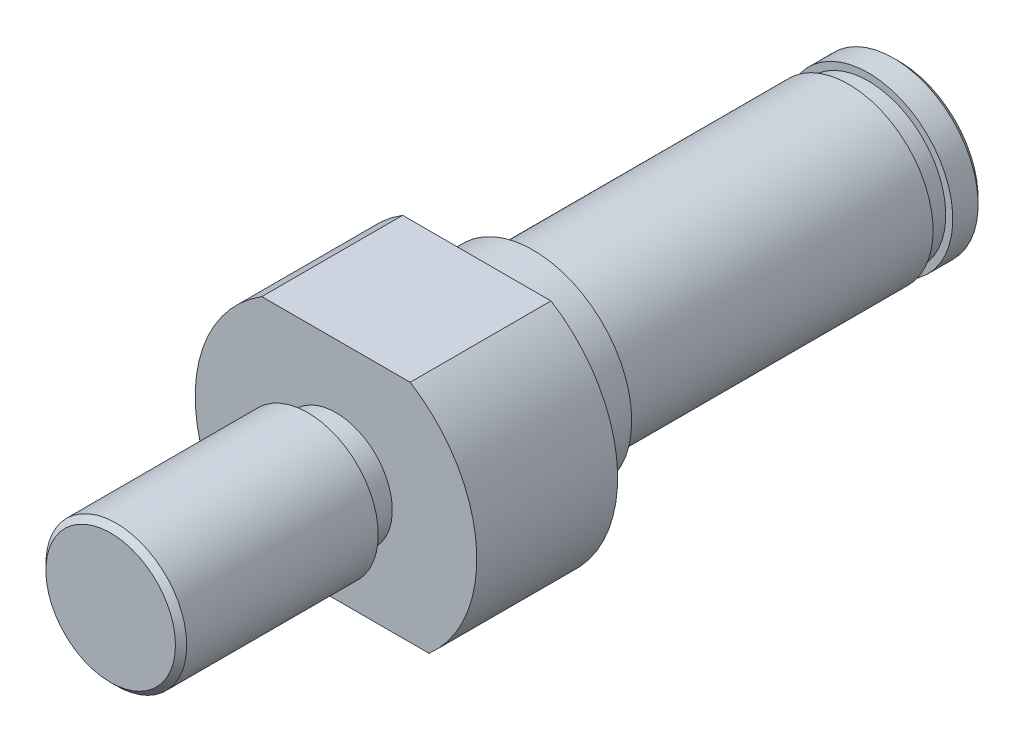
ISO-10303-21;
HEADER;
FILE_DESCRIPTION(('STEP AP214'),'2;1');
FILE_NAME('part.step','',(''),(''),'','','');
FILE_SCHEMA(('AUTOMOTIVE_DESIGN { 1 0 10303 214 1 1 1 1 }'));
ENDSEC;
DATA;
#1=APPLICATION_CONTEXT('core data for automotive mechanical design processes');
#2=APPLICATION_PROTOCOL_DEFINITION('international standard','automotive_design',2000,#1);
#3=PRODUCT_CONTEXT('',#1,'mechanical');
#4=PRODUCT('Part','Part','',(#3));
#5=PRODUCT_RELATED_PRODUCT_CATEGORY('part','',(#4));
#6=PRODUCT_DEFINITION_FORMATION('','',#4);
#7=PRODUCT_DEFINITION_CONTEXT('part definition',#1,'design');
#8=PRODUCT_DEFINITION('design','',#6,#7);
#9=PRODUCT_DEFINITION_SHAPE('','',#8);
#10=(LENGTH_UNIT() NAMED_UNIT(*) SI_UNIT(.MILLI.,.METRE.));
#11=(NAMED_UNIT(*) PLANE_ANGLE_UNIT() SI_UNIT($,.RADIAN.));
#12=(NAMED_UNIT(*) SI_UNIT($,.STERADIAN.) SOLID_ANGLE_UNIT());
#13=UNCERTAINTY_MEASURE_WITH_UNIT(LENGTH_MEASURE(1.E-05),#10,'distance_accuracy_value','');
#14=(GEOMETRIC_REPRESENTATION_CONTEXT(3) GLOBAL_UNCERTAINTY_ASSIGNED_CONTEXT((#13)) GLOBAL_UNIT_ASSIGNED_CONTEXT((#10,
#11,#12)) REPRESENTATION_CONTEXT('',''));
#15=CARTESIAN_POINT('',(0.,0.,0.));
#16=DIRECTION('',(0.,0.,1.));
#17=DIRECTION('',(1.,0.,0.));
#18=AXIS2_PLACEMENT_3D('',#15,#16,#17);
#19=CARTESIAN_POINT('',(0.,0.,-15.));
#20=DIRECTION('',(0.,0.,1.));
#21=DIRECTION('',(1.,0.,0.));
#22=AXIS2_PLACEMENT_3D('',#19,#20,#21);
#23=CYLINDRICAL_SURFACE('',#22,3.);
#24=CARTESIAN_POINT('',(0.,0.,-13.2));
#25=DIRECTION('',(0.,0.,-1.));
#26=DIRECTION('',(-1.,0.,0.));
#27=AXIS2_PLACEMENT_3D('',#24,#25,#26);
#28=CIRCLE('',#27,3.);
#29=CARTESIAN_POINT('',(-3.,0.,-13.2));
#30=VERTEX_POINT('',#29);
#31=EDGE_CURVE('E182',#30,#30,#28,.T.);
#32=ORIENTED_EDGE('',*,*,#31,.F.);
#33=EDGE_LOOP('',(#32));
#34=FACE_BOUND('',#33,.T.);
#35=CARTESIAN_POINT('',(0.,0.,-2.));
#36=DIRECTION('',(0.,0.,-1.));
#37=DIRECTION('',(-1.,0.,0.));
#38=AXIS2_PLACEMENT_3D('',#35,#36,#37);
#39=CIRCLE('',#38,3.);
#40=CARTESIAN_POINT('',(-3.,0.,-2.));
#41=VERTEX_POINT('',#40);
#42=EDGE_CURVE('E106',#41,#41,#39,.T.);
#43=ORIENTED_EDGE('',*,*,#42,.T.);
#44=EDGE_LOOP('',(#43));
#45=FACE_BOUND('',#44,.T.);
#46=ADVANCED_FACE('F34',(#34,#45),#23,.T.);
#47=CARTESIAN_POINT('',(0.,0.,0.));
#48=DIRECTION('',(0.,0.,1.));
#49=DIRECTION('',(1.,0.,0.));
#50=AXIS2_PLACEMENT_3D('',#47,#48,#49);
#51=PLANE('',#50);
#52=CARTESIAN_POINT('',(0.,0.,0.));
#53=DIRECTION('',(0.,0.,1.));
#54=DIRECTION('',(1.,0.,0.));
#55=AXIS2_PLACEMENT_3D('',#52,#53,#54);
#56=CIRCLE('',#55,5.);
#57=CARTESIAN_POINT('',(-2.63391343821319,4.25,0.));
#58=VERTEX_POINT('',#57);
#59=CARTESIAN_POINT('',(-3.30718913883074,-3.75,0.));
#60=VERTEX_POINT('',#59);
#61=EDGE_CURVE('E103',#58,#60,#56,.T.);
#62=ORIENTED_EDGE('',*,*,#61,.F.);
#63=DIRECTION('',(-1.,0.,0.));
#64=VECTOR('',#63,1.);
#65=CARTESIAN_POINT('',(-2.63391343821319,4.25,0.));
#66=LINE('',#65,#64);
#67=CARTESIAN_POINT('',(2.63391343821319,4.25,0.));
#68=VERTEX_POINT('',#67);
#69=EDGE_CURVE('E74',#68,#58,#66,.T.);
#70=ORIENTED_EDGE('',*,*,#69,.F.);
#71=CARTESIAN_POINT('',(0.,0.,0.));
#72=DIRECTION('',(0.,0.,1.));
#73=DIRECTION('',(1.,0.,0.));
#74=AXIS2_PLACEMENT_3D('',#71,#72,#73);
#75=CIRCLE('',#74,5.);
#76=CARTESIAN_POINT('',(3.30718913883074,-3.75,0.));
#77=VERTEX_POINT('',#76);
#78=EDGE_CURVE('E68',#77,#68,#75,.T.);
#79=ORIENTED_EDGE('',*,*,#78,.F.);
#80=DIRECTION('',(1.,0.,0.));
#81=VECTOR('',#80,1.);
#82=CARTESIAN_POINT('',(-3.30718913883074,-3.75,0.));
#83=LINE('',#82,#81);
#84=EDGE_CURVE('E93',#60,#77,#83,.T.);
#85=ORIENTED_EDGE('',*,*,#84,.F.);
#86=EDGE_LOOP('',(#62,#70,#79,#85));
#87=FACE_BOUND('',#86,.T.);
#88=CARTESIAN_POINT('',(0.,0.,0.));
#89=DIRECTION('',(0.,0.,1.));
#90=DIRECTION('',(1.,0.,0.));
#91=AXIS2_PLACEMENT_3D('',#88,#89,#90);
#92=CIRCLE('',#91,3.5);
#93=CARTESIAN_POINT('',(3.5,0.,0.));
#94=VERTEX_POINT('',#93);
#95=EDGE_CURVE('E113',#94,#94,#92,.F.);
#96=ORIENTED_EDGE('',*,*,#95,.F.);
#97=EDGE_LOOP('',(#96));
#98=FACE_BOUND('',#97,.T.);
#99=ADVANCED_FACE('F144',(#87,#98),#51,.F.);
#100=CARTESIAN_POINT('',(0.,0.,5.));
#101=DIRECTION('',(0.,0.,1.));
#102=DIRECTION('',(1.,0.,0.));
#103=AXIS2_PLACEMENT_3D('',#100,#101,#102);
#104=PLANE('',#103);
#105=CARTESIAN_POINT('',(0.,0.,5.));
#106=DIRECTION('',(0.,0.,1.));
#107=DIRECTION('',(1.,0.,0.));
#108=AXIS2_PLACEMENT_3D('',#105,#106,#107);
#109=CIRCLE('',#108,5.);
#110=CARTESIAN_POINT('',(-2.63391343821319,4.25,5.));
#111=VERTEX_POINT('',#110);
#112=CARTESIAN_POINT('',(-3.30718913883074,-3.75,5.));
#113=VERTEX_POINT('',#112);
#114=EDGE_CURVE('E88',#111,#113,#109,.T.);
#115=ORIENTED_EDGE('',*,*,#114,.T.);
#116=DIRECTION('',(1.,0.,0.));
#117=VECTOR('',#116,1.);
#118=CARTESIAN_POINT('',(-3.30718913883074,-3.75,5.));
#119=LINE('',#118,#117);
#120=CARTESIAN_POINT('',(3.30718913883074,-3.75,5.));
#121=VERTEX_POINT('',#120);
#122=EDGE_CURVE('E82',#113,#121,#119,.T.);
#123=ORIENTED_EDGE('',*,*,#122,.T.);
#124=CARTESIAN_POINT('',(0.,0.,5.));
#125=DIRECTION('',(0.,0.,1.));
#126=DIRECTION('',(1.,0.,0.));
#127=AXIS2_PLACEMENT_3D('',#124,#125,#126);
#128=CIRCLE('',#127,5.);
#129=CARTESIAN_POINT('',(2.63391343821319,4.25,5.));
#130=VERTEX_POINT('',#129);
#131=EDGE_CURVE('E86',#121,#130,#128,.T.);
#132=ORIENTED_EDGE('',*,*,#131,.T.);
#133=DIRECTION('',(-1.,0.,0.));
#134=VECTOR('',#133,1.);
#135=CARTESIAN_POINT('',(-2.63391343821319,4.25,5.));
#136=LINE('',#135,#134);
#137=EDGE_CURVE('E51',#130,#111,#136,.T.);
#138=ORIENTED_EDGE('',*,*,#137,.T.);
#139=EDGE_LOOP('',(#115,#123,#132,#138));
#140=FACE_BOUND('',#139,.T.);
#141=CARTESIAN_POINT('',(0.,0.,5.));
#142=DIRECTION('',(0.,0.,-1.));
#143=DIRECTION('',(-1.,0.,0.));
#144=AXIS2_PLACEMENT_3D('',#141,#142,#143);
#145=CIRCLE('',#144,2.);
#146=CARTESIAN_POINT('',(-2.,0.,5.));
#147=VERTEX_POINT('',#146);
#148=EDGE_CURVE('E124',#147,#147,#145,.T.);
#149=ORIENTED_EDGE('',*,*,#148,.T.);
#150=EDGE_LOOP('',(#149));
#151=FACE_BOUND('',#150,.T.);
#152=ADVANCED_FACE('F83',(#140,#151),#104,.T.);
#153=CARTESIAN_POINT('',(0.,0.,5.));
#154=DIRECTION('',(0.,0.,-1.));
#155=DIRECTION('',(-1.,0.,0.));
#156=AXIS2_PLACEMENT_3D('',#153,#154,#155);
#157=CYLINDRICAL_SURFACE('',#156,5.);
#158=ORIENTED_EDGE('',*,*,#61,.T.);
#159=DIRECTION('',(0.,0.,-1.));
#160=VECTOR('',#159,1.);
#161=CARTESIAN_POINT('',(-3.30718913883074,-3.75,5.));
#162=LINE('',#161,#160);
#163=EDGE_CURVE('E94',#113,#60,#162,.T.);
#164=ORIENTED_EDGE('',*,*,#163,.F.);
#165=ORIENTED_EDGE('',*,*,#114,.F.);
#166=DIRECTION('',(0.,0.,-1.));
#167=VECTOR('',#166,1.);
#168=CARTESIAN_POINT('',(-2.63391343821319,4.25,5.));
#169=LINE('',#168,#167);
#170=EDGE_CURVE('E99',#111,#58,#169,.T.);
#171=ORIENTED_EDGE('',*,*,#170,.T.);
#172=EDGE_LOOP('',(#158,#164,#165,#171));
#173=FACE_BOUND('',#172,.T.);
#174=ADVANCED_FACE('F227',(#173),#157,.T.);
#175=CARTESIAN_POINT('',(-3.30718913883074,-3.75,5.));
#176=DIRECTION('',(0.,1.,0.));
#177=DIRECTION('',(0.,0.,1.));
#178=AXIS2_PLACEMENT_3D('',#175,#176,#177);
#179=PLANE('',#178);
#180=ORIENTED_EDGE('',*,*,#84,.T.);
#181=DIRECTION('',(0.,0.,-1.));
#182=VECTOR('',#181,1.);
#183=CARTESIAN_POINT('',(3.30718913883074,-3.75,5.));
#184=LINE('',#183,#182);
#185=EDGE_CURVE('E91',#121,#77,#184,.T.);
#186=ORIENTED_EDGE('',*,*,#185,.F.);
#187=ORIENTED_EDGE('',*,*,#122,.F.);
#188=ORIENTED_EDGE('',*,*,#163,.T.);
#189=EDGE_LOOP('',(#180,#186,#187,#188));
#190=FACE_BOUND('',#189,.T.);
#191=ADVANCED_FACE('F92',(#190),#179,.F.);
#192=CARTESIAN_POINT('',(0.,0.,5.));
#193=DIRECTION('',(0.,0.,-1.));
#194=DIRECTION('',(-1.,0.,0.));
#195=AXIS2_PLACEMENT_3D('',#192,#193,#194);
#196=CYLINDRICAL_SURFACE('',#195,5.);
#197=ORIENTED_EDGE('',*,*,#78,.T.);
#198=DIRECTION('',(0.,0.,-1.));
#199=VECTOR('',#198,1.);
#200=CARTESIAN_POINT('',(2.63391343821319,4.25,5.));
#201=LINE('',#200,#199);
#202=EDGE_CURVE('E95',#130,#68,#201,.T.);
#203=ORIENTED_EDGE('',*,*,#202,.F.);
#204=ORIENTED_EDGE('',*,*,#131,.F.);
#205=ORIENTED_EDGE('',*,*,#185,.T.);
#206=EDGE_LOOP('',(#197,#203,#204,#205));
#207=FACE_BOUND('',#206,.T.);
#208=ADVANCED_FACE('F97',(#207),#196,.T.);
#209=CARTESIAN_POINT('',(-2.63391343821319,4.25,5.));
#210=DIRECTION('',(0.,-1.,0.));
#211=DIRECTION('',(0.,0.,-1.));
#212=AXIS2_PLACEMENT_3D('',#209,#210,#211);
#213=PLANE('',#212);
#214=ORIENTED_EDGE('',*,*,#69,.T.);
#215=ORIENTED_EDGE('',*,*,#170,.F.);
#216=ORIENTED_EDGE('',*,*,#137,.F.);
#217=ORIENTED_EDGE('',*,*,#202,.T.);
#218=EDGE_LOOP('',(#214,#215,#216,#217));
#219=FACE_BOUND('',#218,.T.);
#220=ADVANCED_FACE('F205',(#219),#213,.F.);
#221=CARTESIAN_POINT('',(0.,0.,-2.));
#222=DIRECTION('',(0.,0.,-1.));
#223=DIRECTION('',(-1.,0.,0.));
#224=AXIS2_PLACEMENT_3D('',#221,#222,#223);
#225=PLANE('',#224);
#226=CARTESIAN_POINT('',(0.,0.,-2.));
#227=DIRECTION('',(0.,0.,-1.));
#228=DIRECTION('',(-1.,0.,0.));
#229=AXIS2_PLACEMENT_3D('',#226,#227,#228);
#230=CIRCLE('',#229,3.5);
#231=CARTESIAN_POINT('',(-3.5,0.,-2.));
#232=VERTEX_POINT('',#231);
#233=EDGE_CURVE('E116',#232,#232,#230,.T.);
#234=ORIENTED_EDGE('',*,*,#233,.T.);
#235=EDGE_LOOP('',(#234));
#236=FACE_BOUND('',#235,.T.);
#237=ORIENTED_EDGE('',*,*,#42,.F.);
#238=EDGE_LOOP('',(#237));
#239=FACE_BOUND('',#238,.T.);
#240=ADVANCED_FACE('F188',(#236,#239),#225,.T.);
#241=CARTESIAN_POINT('',(0.,0.,-2.));
#242=DIRECTION('',(0.,0.,1.));
#243=DIRECTION('',(1.,0.,0.));
#244=AXIS2_PLACEMENT_3D('',#241,#242,#243);
#245=CYLINDRICAL_SURFACE('',#244,3.5);
#246=ORIENTED_EDGE('',*,*,#233,.F.);
#247=EDGE_LOOP('',(#246));
#248=FACE_BOUND('',#247,.T.);
#249=ORIENTED_EDGE('',*,*,#95,.T.);
#250=EDGE_LOOP('',(#249));
#251=FACE_BOUND('',#250,.T.);
#252=ADVANCED_FACE('F191',(#248,#251),#245,.T.);
#253=CARTESIAN_POINT('',(-3.,0.,-13.2));
#254=DIRECTION('',(0.,0.,1.));
#255=DIRECTION('',(1.,0.,0.));
#256=AXIS2_PLACEMENT_3D('',#253,#254,#255);
#257=PLANE('',#256);
#258=CARTESIAN_POINT('',(0.,0.,-13.2));
#259=DIRECTION('',(0.,0.,-1.));
#260=DIRECTION('',(-1.,0.,0.));
#261=AXIS2_PLACEMENT_3D('',#258,#259,#260);
#262=CIRCLE('',#261,2.75);
#263=CARTESIAN_POINT('',(-2.75,0.,-13.2));
#264=VERTEX_POINT('',#263);
#265=EDGE_CURVE('E175',#264,#264,#262,.T.);
#266=ORIENTED_EDGE('',*,*,#265,.F.);
#267=EDGE_LOOP('',(#266));
#268=FACE_BOUND('',#267,.T.);
#269=ORIENTED_EDGE('',*,*,#31,.T.);
#270=EDGE_LOOP('',(#269));
#271=FACE_BOUND('',#270,.T.);
#272=ADVANCED_FACE('F194',(#268,#271),#257,.F.);
#273=CARTESIAN_POINT('',(0.,0.,-15.));
#274=DIRECTION('',(0.,0.,-1.));
#275=DIRECTION('',(-1.,0.,0.));
#276=AXIS2_PLACEMENT_3D('',#273,#274,#275);
#277=CYLINDRICAL_SURFACE('',#276,2.75);
#278=CARTESIAN_POINT('',(0.,0.,-13.9));
#279=DIRECTION('',(0.,0.,-1.));
#280=DIRECTION('',(-1.,0.,0.));
#281=AXIS2_PLACEMENT_3D('',#278,#279,#280);
#282=CIRCLE('',#281,2.75);
#283=CARTESIAN_POINT('',(-2.75,0.,-13.9));
#284=VERTEX_POINT('',#283);
#285=EDGE_CURVE('E172',#284,#284,#282,.T.);
#286=ORIENTED_EDGE('',*,*,#285,.F.);
#287=EDGE_LOOP('',(#286));
#288=FACE_BOUND('',#287,.T.);
#289=ORIENTED_EDGE('',*,*,#265,.T.);
#290=EDGE_LOOP('',(#289));
#291=FACE_BOUND('',#290,.T.);
#292=ADVANCED_FACE('F202',(#288,#291),#277,.T.);
#293=CARTESIAN_POINT('',(-3.,0.,-13.9));
#294=DIRECTION('',(0.,0.,-1.));
#295=DIRECTION('',(-1.,0.,0.));
#296=AXIS2_PLACEMENT_3D('',#293,#294,#295);
#297=PLANE('',#296);
#298=CARTESIAN_POINT('',(0.,0.,-13.9));
#299=DIRECTION('',(0.,0.,-1.));
#300=DIRECTION('',(-1.,0.,0.));
#301=AXIS2_PLACEMENT_3D('',#298,#299,#300);
#302=CIRCLE('',#301,3.);
#303=CARTESIAN_POINT('',(-3.,0.,-13.9));
#304=VERTEX_POINT('',#303);
#305=EDGE_CURVE('E123',#304,#304,#302,.T.);
#306=ORIENTED_EDGE('',*,*,#305,.F.);
#307=EDGE_LOOP('',(#306));
#308=FACE_BOUND('',#307,.T.);
#309=ORIENTED_EDGE('',*,*,#285,.T.);
#310=EDGE_LOOP('',(#309));
#311=FACE_BOUND('',#310,.T.);
#312=ADVANCED_FACE('F167',(#308,#311),#297,.F.);
#313=CARTESIAN_POINT('',(0.,0.,-15.));
#314=DIRECTION('',(0.,0.,-1.));
#315=DIRECTION('',(-1.,0.,0.));
#316=AXIS2_PLACEMENT_3D('',#313,#314,#315);
#317=PLANE('',#316);
#318=CARTESIAN_POINT('',(0.,0.,-15.));
#319=DIRECTION('',(0.,0.,-1.));
#320=DIRECTION('',(-1.,0.,0.));
#321=AXIS2_PLACEMENT_3D('',#318,#319,#320);
#322=CIRCLE('',#321,2.8);
#323=CARTESIAN_POINT('',(-2.8,0.,-15.));
#324=VERTEX_POINT('',#323);
#325=EDGE_CURVE('E43',#324,#324,#322,.T.);
#326=ORIENTED_EDGE('',*,*,#325,.T.);
#327=EDGE_LOOP('',(#326));
#328=FACE_BOUND('',#327,.T.);
#329=ADVANCED_FACE('F132',(#328),#317,.T.);
#330=CARTESIAN_POINT('',(0.,0.,-14.8));
#331=DIRECTION('',(0.,0.,-1.));
#332=DIRECTION('',(-1.,0.,0.));
#333=AXIS2_PLACEMENT_3D('',#330,#331,#332);
#334=CIRCLE('',#333,3.);
#335=CARTESIAN_POINT('',(-3.,0.,-14.8));
#336=VERTEX_POINT('',#335);
#337=EDGE_CURVE('E11',#336,#336,#334,.F.);
#338=ORIENTED_EDGE('',*,*,#337,.T.);
#339=EDGE_LOOP('',(#338));
#340=FACE_BOUND('',#339,.T.);
#341=ORIENTED_EDGE('',*,*,#305,.T.);
#342=EDGE_LOOP('',(#341));
#343=FACE_BOUND('',#342,.T.);
#344=ADVANCED_FACE('F147',(#340,#343),#23,.T.);
#345=CARTESIAN_POINT('',(-3.3239857470289,0.,6.));
#346=DIRECTION('',(0.,0.,1.));
#347=DIRECTION('',(1.,0.,0.));
#348=AXIS2_PLACEMENT_3D('',#345,#346,#347);
#349=PLANE('',#348);
#350=CARTESIAN_POINT('',(0.,0.,6.));
#351=DIRECTION('',(0.,0.,-1.));
#352=DIRECTION('',(-1.,0.,0.));
#353=AXIS2_PLACEMENT_3D('',#350,#351,#352);
#354=CIRCLE('',#353,2.);
#355=CARTESIAN_POINT('',(-2.,0.,6.));
#356=VERTEX_POINT('',#355);
#357=EDGE_CURVE('E225',#356,#356,#354,.T.);
#358=ORIENTED_EDGE('',*,*,#357,.F.);
#359=EDGE_LOOP('',(#358));
#360=FACE_BOUND('',#359,.T.);
#361=CARTESIAN_POINT('',(0.,0.,6.));
#362=DIRECTION('',(0.,0.,1.));
#363=DIRECTION('',(1.,0.,0.));
#364=AXIS2_PLACEMENT_3D('',#361,#362,#363);
#365=CIRCLE('',#364,2.5);
#366=CARTESIAN_POINT('',(2.5,0.,6.));
#367=VERTEX_POINT('',#366);
#368=EDGE_CURVE('E120',#367,#367,#365,.T.);
#369=ORIENTED_EDGE('',*,*,#368,.F.);
#370=EDGE_LOOP('',(#369));
#371=FACE_BOUND('',#370,.T.);
#372=ADVANCED_FACE('F158',(#360,#371),#349,.F.);
#373=CARTESIAN_POINT('',(0.,0.,-15.));
#374=DIRECTION('',(0.,0.,-1.));
#375=DIRECTION('',(-1.,0.,0.));
#376=AXIS2_PLACEMENT_3D('',#373,#374,#375);
#377=CYLINDRICAL_SURFACE('',#376,2.);
#378=ORIENTED_EDGE('',*,*,#148,.F.);
#379=EDGE_LOOP('',(#378));
#380=FACE_BOUND('',#379,.T.);
#381=ORIENTED_EDGE('',*,*,#357,.T.);
#382=EDGE_LOOP('',(#381));
#383=FACE_BOUND('',#382,.T.);
#384=ADVANCED_FACE('F164',(#380,#383),#377,.T.);
#385=CARTESIAN_POINT('',(0.,0.,13.));
#386=DIRECTION('',(0.,0.,1.));
#387=DIRECTION('',(1.,0.,0.));
#388=AXIS2_PLACEMENT_3D('',#385,#386,#387);
#389=PLANE('',#388);
#390=CARTESIAN_POINT('',(0.,0.,13.));
#391=DIRECTION('',(0.,0.,1.));
#392=DIRECTION('',(1.,0.,0.));
#393=AXIS2_PLACEMENT_3D('',#390,#391,#392);
#394=CIRCLE('',#393,2.3);
#395=CARTESIAN_POINT('',(2.3,0.,13.));
#396=VERTEX_POINT('',#395);
#397=EDGE_CURVE('E119',#396,#396,#394,.T.);
#398=ORIENTED_EDGE('',*,*,#397,.T.);
#399=EDGE_LOOP('',(#398));
#400=FACE_BOUND('',#399,.T.);
#401=ADVANCED_FACE('F214',(#400),#389,.T.);
#402=CARTESIAN_POINT('',(0.,0.,13.));
#403=DIRECTION('',(0.,0.,-1.));
#404=DIRECTION('',(-1.,0.,0.));
#405=AXIS2_PLACEMENT_3D('',#402,#403,#404);
#406=CYLINDRICAL_SURFACE('',#405,2.5);
#407=CARTESIAN_POINT('',(0.,0.,12.8));
#408=DIRECTION('',(0.,0.,1.));
#409=DIRECTION('',(1.,0.,0.));
#410=AXIS2_PLACEMENT_3D('',#407,#408,#409);
#411=CIRCLE('',#410,2.5);
#412=CARTESIAN_POINT('',(2.5,0.,12.8));
#413=VERTEX_POINT('',#412);
#414=EDGE_CURVE('E127',#413,#413,#411,.F.);
#415=ORIENTED_EDGE('',*,*,#414,.T.);
#416=EDGE_LOOP('',(#415));
#417=FACE_BOUND('',#416,.T.);
#418=ORIENTED_EDGE('',*,*,#368,.T.);
#419=EDGE_LOOP('',(#418));
#420=FACE_BOUND('',#419,.T.);
#421=ADVANCED_FACE('F140',(#417,#420),#406,.T.);
#422=CARTESIAN_POINT('',(0.,0.,13.));
#423=DIRECTION('',(0.,0.,-1.));
#424=DIRECTION('',(-1.,0.,0.));
#425=AXIS2_PLACEMENT_3D('',#422,#423,#424);
#426=CONICAL_SURFACE('',#425,2.3,0.785398163397443);
#427=ORIENTED_EDGE('',*,*,#414,.F.);
#428=EDGE_LOOP('',(#427));
#429=FACE_BOUND('',#428,.T.);
#430=ORIENTED_EDGE('',*,*,#397,.F.);
#431=EDGE_LOOP('',(#430));
#432=FACE_BOUND('',#431,.T.);
#433=ADVANCED_FACE('F135',(#429,#432),#426,.T.);
#434=CARTESIAN_POINT('',(0.,0.,-15.));
#435=DIRECTION('',(0.,0.,1.));
#436=DIRECTION('',(1.,0.,0.));
#437=AXIS2_PLACEMENT_3D('',#434,#435,#436);
#438=CONICAL_SURFACE('',#437,2.8,0.785398163397447);
#439=ORIENTED_EDGE('',*,*,#337,.F.);
#440=EDGE_LOOP('',(#439));
#441=FACE_BOUND('',#440,.T.);
#442=ORIENTED_EDGE('',*,*,#325,.F.);
#443=EDGE_LOOP('',(#442));
#444=FACE_BOUND('',#443,.T.);
#445=ADVANCED_FACE('F36',(#441,#444),#438,.T.);
#446=CLOSED_SHELL('',(#46,#99,#152,#174,#191,#208,#220,#240,#252,#272,#292,#312,#329,#344,#372,
#384,#401,#421,#433,#445));
#447=MANIFOLD_SOLID_BREP('B2',#446);
#448=ADVANCED_BREP_SHAPE_REPRESENTATION('',(#18,#447),#14);
#449=SHAPE_DEFINITION_REPRESENTATION(#9,#448);
ENDSEC;
END-ISO-10303-21;
